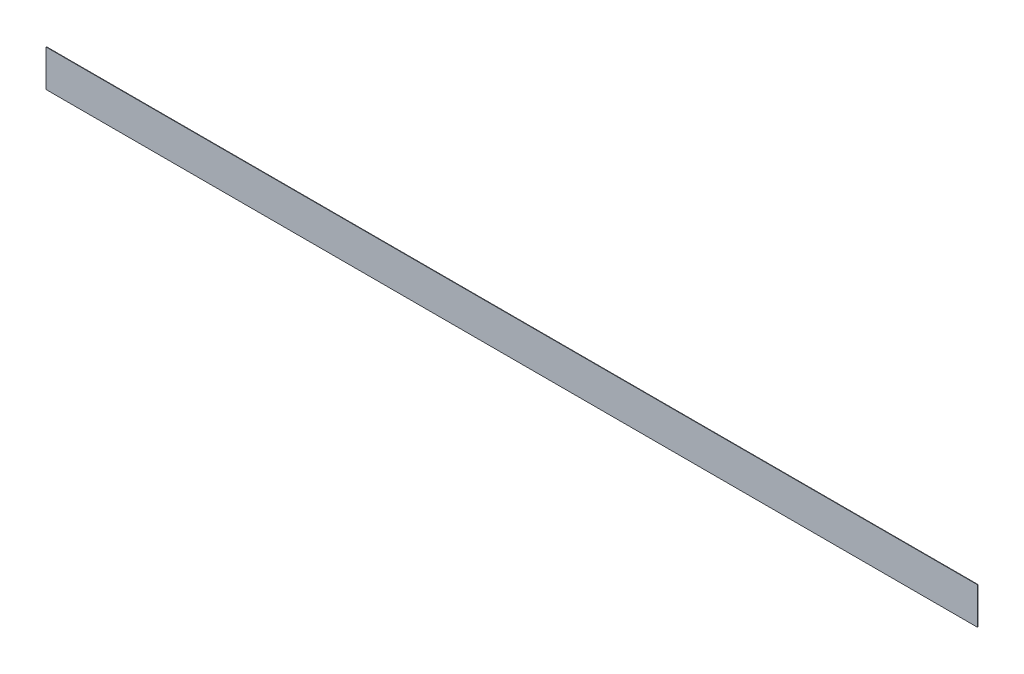
ISO-10303-21;
HEADER;
FILE_DESCRIPTION(('STEP AP214'),'2;1');
FILE_NAME('part.step','',(''),(''),'','','');
FILE_SCHEMA(('AUTOMOTIVE_DESIGN { 1 0 10303 214 1 1 1 1 }'));
ENDSEC;
DATA;
#1=APPLICATION_CONTEXT('core data for automotive mechanical design processes');
#2=APPLICATION_PROTOCOL_DEFINITION('international standard','automotive_design',2000,#1);
#3=PRODUCT_CONTEXT('',#1,'mechanical');
#4=PRODUCT('Part','Part','',(#3));
#5=PRODUCT_RELATED_PRODUCT_CATEGORY('part','',(#4));
#6=PRODUCT_DEFINITION_FORMATION('','',#4);
#7=PRODUCT_DEFINITION_CONTEXT('part definition',#1,'design');
#8=PRODUCT_DEFINITION('design','',#6,#7);
#9=PRODUCT_DEFINITION_SHAPE('','',#8);
#10=(LENGTH_UNIT() NAMED_UNIT(*) SI_UNIT(.MILLI.,.METRE.));
#11=(NAMED_UNIT(*) PLANE_ANGLE_UNIT() SI_UNIT($,.RADIAN.));
#12=(NAMED_UNIT(*) SI_UNIT($,.STERADIAN.) SOLID_ANGLE_UNIT());
#13=UNCERTAINTY_MEASURE_WITH_UNIT(LENGTH_MEASURE(1.E-05),#10,'distance_accuracy_value','');
#14=(GEOMETRIC_REPRESENTATION_CONTEXT(3) GLOBAL_UNCERTAINTY_ASSIGNED_CONTEXT((#13)) GLOBAL_UNIT_ASSIGNED_CONTEXT((#10,
#11,#12)) REPRESENTATION_CONTEXT('',''));
#15=CARTESIAN_POINT('',(0.,0.,0.));
#16=DIRECTION('',(0.,0.,1.));
#17=DIRECTION('',(1.,0.,0.));
#18=AXIS2_PLACEMENT_3D('',#15,#16,#17);
#19=CARTESIAN_POINT('',(-349.25,508.,-6.35000000000008));
#20=DIRECTION('',(0.,0.,-1.));
#21=DIRECTION('',(1.,0.,0.));
#22=AXIS2_PLACEMENT_3D('',#19,#20,#21);
#23=PLANE('',#22);
#24=DIRECTION('',(0.,1.,0.));
#25=VECTOR('',#24,1.);
#26=CARTESIAN_POINT('',(0.,0.,-6.34999999999941));
#27=LINE('',#26,#25);
#28=CARTESIAN_POINT('',(0.,0.,-6.34999999999941));
#29=VERTEX_POINT('',#28);
#30=CARTESIAN_POINT('',(0.,508.,-6.34999999999941));
#31=VERTEX_POINT('',#30);
#32=EDGE_CURVE('E42',#29,#31,#27,.T.);
#33=ORIENTED_EDGE('',*,*,#32,.F.);
#34=DIRECTION('',(-1.,0.,0.));
#35=VECTOR('',#34,1.);
#36=CARTESIAN_POINT('',(0.,0.,-6.34999999999941));
#37=LINE('',#36,#35);
#38=CARTESIAN_POINT('',(-12838.10615,-1.57221456036557E-12,-6.34999999999941));
#39=VERTEX_POINT('',#38);
#40=EDGE_CURVE('E65',#29,#39,#37,.T.);
#41=ORIENTED_EDGE('',*,*,#40,.T.);
#42=DIRECTION('',(0.,1.,0.));
#43=VECTOR('',#42,1.);
#44=CARTESIAN_POINT('',(-12838.10615,0.,-6.34999999999941));
#45=LINE('',#44,#43);
#46=CARTESIAN_POINT('',(-12838.10615,507.999999999998,-6.34999999999941));
#47=VERTEX_POINT('',#46);
#48=EDGE_CURVE('E70',#39,#47,#45,.T.);
#49=ORIENTED_EDGE('',*,*,#48,.T.);
#50=DIRECTION('',(-1.,0.,0.));
#51=VECTOR('',#50,1.);
#52=CARTESIAN_POINT('',(0.,508.,-6.34999999999941));
#53=LINE('',#52,#51);
#54=EDGE_CURVE('E85',#31,#47,#53,.T.);
#55=ORIENTED_EDGE('',*,*,#54,.F.);
#56=EDGE_LOOP('',(#33,#41,#49,#55));
#57=FACE_BOUND('',#56,.T.);
#58=ADVANCED_FACE('F34',(#57),#23,.T.);
#59=CARTESIAN_POINT('',(0.,0.,0.));
#60=DIRECTION('',(0.,0.,1.));
#61=DIRECTION('',(1.,0.,0.));
#62=AXIS2_PLACEMENT_3D('',#59,#60,#61);
#63=PLANE('',#62);
#64=DIRECTION('',(0.,1.,0.));
#65=VECTOR('',#64,1.);
#66=CARTESIAN_POINT('',(0.,0.,0.));
#67=LINE('',#66,#65);
#68=CARTESIAN_POINT('',(0.,0.,0.));
#69=VERTEX_POINT('',#68);
#70=CARTESIAN_POINT('',(0.,508.,0.));
#71=VERTEX_POINT('',#70);
#72=EDGE_CURVE('E94',#69,#71,#67,.T.);
#73=ORIENTED_EDGE('',*,*,#72,.T.);
#74=DIRECTION('',(-1.,0.,0.));
#75=VECTOR('',#74,1.);
#76=CARTESIAN_POINT('',(0.,508.,0.));
#77=LINE('',#76,#75);
#78=CARTESIAN_POINT('',(-12838.10615,507.999999999998,0.));
#79=VERTEX_POINT('',#78);
#80=EDGE_CURVE('E83',#71,#79,#77,.T.);
#81=ORIENTED_EDGE('',*,*,#80,.T.);
#82=DIRECTION('',(0.,1.,0.));
#83=VECTOR('',#82,1.);
#84=CARTESIAN_POINT('',(-12838.10615,0.,0.));
#85=LINE('',#84,#83);
#86=CARTESIAN_POINT('',(-12838.10615,-1.57221456037114E-12,0.));
#87=VERTEX_POINT('',#86);
#88=EDGE_CURVE('E87',#87,#79,#85,.T.);
#89=ORIENTED_EDGE('',*,*,#88,.F.);
#90=DIRECTION('',(-1.,0.,0.));
#91=VECTOR('',#90,1.);
#92=CARTESIAN_POINT('',(0.,0.,0.));
#93=LINE('',#92,#91);
#94=EDGE_CURVE('E101',#69,#87,#93,.T.);
#95=ORIENTED_EDGE('',*,*,#94,.F.);
#96=EDGE_LOOP('',(#73,#81,#89,#95));
#97=FACE_BOUND('',#96,.T.);
#98=ADVANCED_FACE('F93',(#97),#63,.T.);
#99=CARTESIAN_POINT('',(0.,508.,-12854.5029224503));
#100=DIRECTION('',(0.,1.,0.));
#101=DIRECTION('',(-1.,0.,0.));
#102=AXIS2_PLACEMENT_3D('',#99,#100,#101);
#103=PLANE('',#102);
#104=DIRECTION('',(0.,0.,1.));
#105=VECTOR('',#104,1.);
#106=CARTESIAN_POINT('',(0.,508.,-12854.5029224503));
#107=LINE('',#106,#105);
#108=EDGE_CURVE('E11',#31,#71,#107,.T.);
#109=ORIENTED_EDGE('',*,*,#108,.F.);
#110=ORIENTED_EDGE('',*,*,#54,.T.);
#111=DIRECTION('',(0.,0.,1.));
#112=VECTOR('',#111,1.);
#113=CARTESIAN_POINT('',(-12838.10615,507.999999999998,-12854.5029224503));
#114=LINE('',#113,#112);
#115=EDGE_CURVE('E80',#47,#79,#114,.T.);
#116=ORIENTED_EDGE('',*,*,#115,.T.);
#117=ORIENTED_EDGE('',*,*,#80,.F.);
#118=EDGE_LOOP('',(#109,#110,#116,#117));
#119=FACE_BOUND('',#118,.T.);
#120=ADVANCED_FACE('F81',(#119),#103,.T.);
#121=CARTESIAN_POINT('',(-12838.10615,0.,-12854.5029224503));
#122=DIRECTION('',(1.,0.,0.));
#123=DIRECTION('',(0.,0.,-1.));
#124=AXIS2_PLACEMENT_3D('',#121,#122,#123);
#125=PLANE('',#124);
#126=ORIENTED_EDGE('',*,*,#48,.F.);
#127=DIRECTION('',(0.,0.,1.));
#128=VECTOR('',#127,1.);
#129=CARTESIAN_POINT('',(-12838.10615,-1.57221456037114E-12,-12854.5029224503));
#130=LINE('',#129,#128);
#131=EDGE_CURVE('E75',#39,#87,#130,.T.);
#132=ORIENTED_EDGE('',*,*,#131,.T.);
#133=ORIENTED_EDGE('',*,*,#88,.T.);
#134=ORIENTED_EDGE('',*,*,#115,.F.);
#135=EDGE_LOOP('',(#126,#132,#133,#134));
#136=FACE_BOUND('',#135,.T.);
#137=ADVANCED_FACE('F88',(#136),#125,.F.);
#138=CARTESIAN_POINT('',(0.,0.,-12854.5029224503));
#139=DIRECTION('',(0.,1.,0.));
#140=DIRECTION('',(-1.,0.,0.));
#141=AXIS2_PLACEMENT_3D('',#138,#139,#140);
#142=PLANE('',#141);
#143=ORIENTED_EDGE('',*,*,#40,.F.);
#144=DIRECTION('',(0.,0.,1.));
#145=VECTOR('',#144,1.);
#146=CARTESIAN_POINT('',(0.,0.,-12854.5029224503));
#147=LINE('',#146,#145);
#148=EDGE_CURVE('E91',#29,#69,#147,.T.);
#149=ORIENTED_EDGE('',*,*,#148,.T.);
#150=ORIENTED_EDGE('',*,*,#94,.T.);
#151=ORIENTED_EDGE('',*,*,#131,.F.);
#152=EDGE_LOOP('',(#143,#149,#150,#151));
#153=FACE_BOUND('',#152,.T.);
#154=ADVANCED_FACE('F107',(#153),#142,.F.);
#155=CARTESIAN_POINT('',(0.,0.,-12854.5029224503));
#156=DIRECTION('',(1.,0.,0.));
#157=DIRECTION('',(0.,0.,-1.));
#158=AXIS2_PLACEMENT_3D('',#155,#156,#157);
#159=PLANE('',#158);
#160=ORIENTED_EDGE('',*,*,#148,.F.);
#161=ORIENTED_EDGE('',*,*,#32,.T.);
#162=ORIENTED_EDGE('',*,*,#108,.T.);
#163=ORIENTED_EDGE('',*,*,#72,.F.);
#164=EDGE_LOOP('',(#160,#161,#162,#163));
#165=FACE_BOUND('',#164,.T.);
#166=ADVANCED_FACE('F108',(#165),#159,.T.);
#167=CLOSED_SHELL('',(#58,#98,#120,#137,#154,#166));
#168=MANIFOLD_SOLID_BREP('B2',#167);
#169=ADVANCED_BREP_SHAPE_REPRESENTATION('',(#18,#168),#14);
#170=SHAPE_DEFINITION_REPRESENTATION(#9,#169);
ENDSEC;
END-ISO-10303-21;
